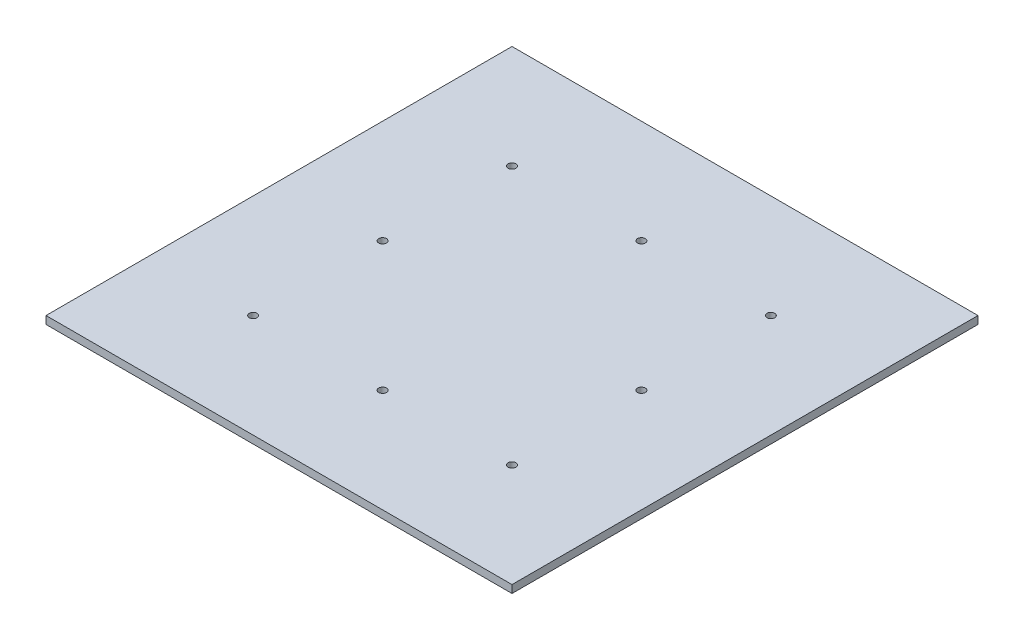
ISO-10303-21;
HEADER;
FILE_DESCRIPTION(('STEP AP214'),'2;1');
FILE_NAME('part.step','',(''),(''),'','','');
FILE_SCHEMA(('AUTOMOTIVE_DESIGN { 1 0 10303 214 1 1 1 1 }'));
ENDSEC;
DATA;
#1=APPLICATION_CONTEXT('core data for automotive mechanical design processes');
#2=APPLICATION_PROTOCOL_DEFINITION('international standard','automotive_design',2000,#1);
#3=PRODUCT_CONTEXT('',#1,'mechanical');
#4=PRODUCT('Part','Part','',(#3));
#5=PRODUCT_RELATED_PRODUCT_CATEGORY('part','',(#4));
#6=PRODUCT_DEFINITION_FORMATION('','',#4);
#7=PRODUCT_DEFINITION_CONTEXT('part definition',#1,'design');
#8=PRODUCT_DEFINITION('design','',#6,#7);
#9=PRODUCT_DEFINITION_SHAPE('','',#8);
#10=(LENGTH_UNIT() NAMED_UNIT(*) SI_UNIT(.MILLI.,.METRE.));
#11=(NAMED_UNIT(*) PLANE_ANGLE_UNIT() SI_UNIT($,.RADIAN.));
#12=(NAMED_UNIT(*) SI_UNIT($,.STERADIAN.) SOLID_ANGLE_UNIT());
#13=UNCERTAINTY_MEASURE_WITH_UNIT(LENGTH_MEASURE(1.E-05),#10,'distance_accuracy_value','');
#14=(GEOMETRIC_REPRESENTATION_CONTEXT(3) GLOBAL_UNCERTAINTY_ASSIGNED_CONTEXT((#13)) GLOBAL_UNIT_ASSIGNED_CONTEXT((#10,
#11,#12)) REPRESENTATION_CONTEXT('',''));
#15=CARTESIAN_POINT('',(0.,0.,0.));
#16=DIRECTION('',(0.,0.,1.));
#17=DIRECTION('',(1.,0.,0.));
#18=AXIS2_PLACEMENT_3D('',#15,#16,#17);
#19=CARTESIAN_POINT('',(0.,3.,0.));
#20=DIRECTION('',(1.,0.,0.));
#21=DIRECTION('',(0.,0.,-1.));
#22=AXIS2_PLACEMENT_3D('',#19,#20,#21);
#23=PLANE('',#22);
#24=DIRECTION('',(0.,0.,1.));
#25=VECTOR('',#24,1.);
#26=CARTESIAN_POINT('',(0.,0.,0.));
#27=LINE('',#26,#25);
#28=CARTESIAN_POINT('',(0.,0.,0.));
#29=VERTEX_POINT('',#28);
#30=CARTESIAN_POINT('',(0.,0.,180.));
#31=VERTEX_POINT('',#30);
#32=EDGE_CURVE('E113',#29,#31,#27,.T.);
#33=ORIENTED_EDGE('',*,*,#32,.T.);
#34=DIRECTION('',(0.,-1.,0.));
#35=VECTOR('',#34,1.);
#36=CARTESIAN_POINT('',(0.,3.,180.));
#37=LINE('',#36,#35);
#38=CARTESIAN_POINT('',(0.,3.,180.));
#39=VERTEX_POINT('',#38);
#40=EDGE_CURVE('E11',#39,#31,#37,.T.);
#41=ORIENTED_EDGE('',*,*,#40,.F.);
#42=DIRECTION('',(0.,0.,1.));
#43=VECTOR('',#42,1.);
#44=CARTESIAN_POINT('',(0.,3.,0.));
#45=LINE('',#44,#43);
#46=CARTESIAN_POINT('',(0.,3.,0.));
#47=VERTEX_POINT('',#46);
#48=EDGE_CURVE('E97',#47,#39,#45,.T.);
#49=ORIENTED_EDGE('',*,*,#48,.F.);
#50=DIRECTION('',(0.,-1.,0.));
#51=VECTOR('',#50,1.);
#52=CARTESIAN_POINT('',(0.,3.,0.));
#53=LINE('',#52,#51);
#54=EDGE_CURVE('E109',#47,#29,#53,.T.);
#55=ORIENTED_EDGE('',*,*,#54,.T.);
#56=EDGE_LOOP('',(#33,#41,#49,#55));
#57=FACE_BOUND('',#56,.T.);
#58=ADVANCED_FACE('F45',(#57),#23,.F.);
#59=CARTESIAN_POINT('',(0.,3.,180.));
#60=DIRECTION('',(0.,0.,-1.));
#61=DIRECTION('',(-1.,0.,0.));
#62=AXIS2_PLACEMENT_3D('',#59,#60,#61);
#63=PLANE('',#62);
#64=DIRECTION('',(1.,0.,0.));
#65=VECTOR('',#64,1.);
#66=CARTESIAN_POINT('',(0.,0.,180.));
#67=LINE('',#66,#65);
#68=CARTESIAN_POINT('',(180.,0.,180.));
#69=VERTEX_POINT('',#68);
#70=EDGE_CURVE('E102',#31,#69,#67,.T.);
#71=ORIENTED_EDGE('',*,*,#70,.T.);
#72=DIRECTION('',(0.,-1.,0.));
#73=VECTOR('',#72,1.);
#74=CARTESIAN_POINT('',(180.,3.,180.));
#75=LINE('',#74,#73);
#76=CARTESIAN_POINT('',(180.,3.,180.));
#77=VERTEX_POINT('',#76);
#78=EDGE_CURVE('E54',#77,#69,#75,.T.);
#79=ORIENTED_EDGE('',*,*,#78,.F.);
#80=DIRECTION('',(1.,0.,0.));
#81=VECTOR('',#80,1.);
#82=CARTESIAN_POINT('',(0.,3.,180.));
#83=LINE('',#82,#81);
#84=EDGE_CURVE('E92',#39,#77,#83,.T.);
#85=ORIENTED_EDGE('',*,*,#84,.F.);
#86=ORIENTED_EDGE('',*,*,#40,.T.);
#87=EDGE_LOOP('',(#71,#79,#85,#86));
#88=FACE_BOUND('',#87,.T.);
#89=ADVANCED_FACE('F101',(#88),#63,.F.);
#90=CARTESIAN_POINT('',(180.,3.,0.));
#91=DIRECTION('',(-1.,0.,0.));
#92=DIRECTION('',(0.,0.,1.));
#93=AXIS2_PLACEMENT_3D('',#90,#91,#92);
#94=PLANE('',#93);
#95=DIRECTION('',(0.,0.,-1.));
#96=VECTOR('',#95,1.);
#97=CARTESIAN_POINT('',(180.,0.,0.));
#98=LINE('',#97,#96);
#99=CARTESIAN_POINT('',(180.,0.,0.));
#100=VERTEX_POINT('',#99);
#101=EDGE_CURVE('E79',#69,#100,#98,.T.);
#102=ORIENTED_EDGE('',*,*,#101,.T.);
#103=DIRECTION('',(0.,-1.,0.));
#104=VECTOR('',#103,1.);
#105=CARTESIAN_POINT('',(180.,3.,0.));
#106=LINE('',#105,#104);
#107=CARTESIAN_POINT('',(180.,3.,0.));
#108=VERTEX_POINT('',#107);
#109=EDGE_CURVE('E104',#108,#100,#106,.T.);
#110=ORIENTED_EDGE('',*,*,#109,.F.);
#111=DIRECTION('',(0.,0.,-1.));
#112=VECTOR('',#111,1.);
#113=CARTESIAN_POINT('',(180.,3.,0.));
#114=LINE('',#113,#112);
#115=EDGE_CURVE('E95',#77,#108,#114,.T.);
#116=ORIENTED_EDGE('',*,*,#115,.F.);
#117=ORIENTED_EDGE('',*,*,#78,.T.);
#118=EDGE_LOOP('',(#102,#110,#116,#117));
#119=FACE_BOUND('',#118,.T.);
#120=ADVANCED_FACE('F105',(#119),#94,.F.);
#121=CARTESIAN_POINT('',(0.,3.,0.));
#122=DIRECTION('',(0.,0.,1.));
#123=DIRECTION('',(1.,0.,0.));
#124=AXIS2_PLACEMENT_3D('',#121,#122,#123);
#125=PLANE('',#124);
#126=DIRECTION('',(-1.,0.,0.));
#127=VECTOR('',#126,1.);
#128=CARTESIAN_POINT('',(0.,0.,0.));
#129=LINE('',#128,#127);
#130=EDGE_CURVE('E85',#100,#29,#129,.T.);
#131=ORIENTED_EDGE('',*,*,#130,.T.);
#132=ORIENTED_EDGE('',*,*,#54,.F.);
#133=DIRECTION('',(-1.,0.,0.));
#134=VECTOR('',#133,1.);
#135=CARTESIAN_POINT('',(0.,3.,0.));
#136=LINE('',#135,#134);
#137=EDGE_CURVE('E62',#108,#47,#136,.T.);
#138=ORIENTED_EDGE('',*,*,#137,.F.);
#139=ORIENTED_EDGE('',*,*,#109,.T.);
#140=EDGE_LOOP('',(#131,#132,#138,#139));
#141=FACE_BOUND('',#140,.T.);
#142=ADVANCED_FACE('F127',(#141),#125,.F.);
#143=CARTESIAN_POINT('',(0.,3.,0.));
#144=DIRECTION('',(0.,1.,0.));
#145=DIRECTION('',(0.,0.,1.));
#146=AXIS2_PLACEMENT_3D('',#143,#144,#145);
#147=PLANE('',#146);
#148=CARTESIAN_POINT('',(140.,3.,40.));
#149=DIRECTION('',(0.,1.,0.));
#150=DIRECTION('',(0.,0.,1.));
#151=AXIS2_PLACEMENT_3D('',#148,#149,#150);
#152=CIRCLE('',#151,1.50000000000003);
#153=CARTESIAN_POINT('',(140.,3.,41.5));
#154=VERTEX_POINT('',#153);
#155=EDGE_CURVE('E138',#154,#154,#152,.T.);
#156=ORIENTED_EDGE('',*,*,#155,.F.);
#157=EDGE_LOOP('',(#156));
#158=FACE_BOUND('',#157,.T.);
#159=CARTESIAN_POINT('',(140.,3.,140.));
#160=DIRECTION('',(0.,1.,0.));
#161=DIRECTION('',(0.,0.,1.));
#162=AXIS2_PLACEMENT_3D('',#159,#160,#161);
#163=CIRCLE('',#162,1.50000000000002);
#164=CARTESIAN_POINT('',(140.,3.,141.5));
#165=VERTEX_POINT('',#164);
#166=EDGE_CURVE('E163',#165,#165,#163,.T.);
#167=ORIENTED_EDGE('',*,*,#166,.F.);
#168=EDGE_LOOP('',(#167));
#169=FACE_BOUND('',#168,.T.);
#170=CARTESIAN_POINT('',(40.,3.,140.));
#171=DIRECTION('',(0.,1.,0.));
#172=DIRECTION('',(0.,0.,1.));
#173=AXIS2_PLACEMENT_3D('',#170,#171,#172);
#174=CIRCLE('',#173,1.5);
#175=CARTESIAN_POINT('',(40.,3.,141.5));
#176=VERTEX_POINT('',#175);
#177=EDGE_CURVE('E155',#176,#176,#174,.T.);
#178=ORIENTED_EDGE('',*,*,#177,.F.);
#179=EDGE_LOOP('',(#178));
#180=FACE_BOUND('',#179,.T.);
#181=CARTESIAN_POINT('',(90.,3.,40.));
#182=DIRECTION('',(0.,1.,0.));
#183=DIRECTION('',(0.,0.,1.));
#184=AXIS2_PLACEMENT_3D('',#181,#182,#183);
#185=CIRCLE('',#184,1.5);
#186=CARTESIAN_POINT('',(90.,3.,41.5));
#187=VERTEX_POINT('',#186);
#188=EDGE_CURVE('E146',#187,#187,#185,.T.);
#189=ORIENTED_EDGE('',*,*,#188,.F.);
#190=EDGE_LOOP('',(#189));
#191=FACE_BOUND('',#190,.T.);
#192=CARTESIAN_POINT('',(140.,3.,90.));
#193=DIRECTION('',(0.,1.,0.));
#194=DIRECTION('',(0.,0.,1.));
#195=AXIS2_PLACEMENT_3D('',#192,#193,#194);
#196=CIRCLE('',#195,1.5);
#197=CARTESIAN_POINT('',(140.,3.,91.5));
#198=VERTEX_POINT('',#197);
#199=EDGE_CURVE('E147',#198,#198,#196,.T.);
#200=ORIENTED_EDGE('',*,*,#199,.F.);
#201=EDGE_LOOP('',(#200));
#202=FACE_BOUND('',#201,.T.);
#203=CARTESIAN_POINT('',(90.,3.,140.));
#204=DIRECTION('',(0.,1.,0.));
#205=DIRECTION('',(0.,0.,1.));
#206=AXIS2_PLACEMENT_3D('',#203,#204,#205);
#207=CIRCLE('',#206,1.5);
#208=CARTESIAN_POINT('',(90.,3.,141.5));
#209=VERTEX_POINT('',#208);
#210=EDGE_CURVE('E186',#209,#209,#207,.T.);
#211=ORIENTED_EDGE('',*,*,#210,.F.);
#212=EDGE_LOOP('',(#211));
#213=FACE_BOUND('',#212,.T.);
#214=CARTESIAN_POINT('',(40.,3.,90.));
#215=DIRECTION('',(0.,1.,0.));
#216=DIRECTION('',(0.,0.,1.));
#217=AXIS2_PLACEMENT_3D('',#214,#215,#216);
#218=CIRCLE('',#217,1.5);
#219=CARTESIAN_POINT('',(40.,3.,91.5));
#220=VERTEX_POINT('',#219);
#221=EDGE_CURVE('E178',#220,#220,#218,.T.);
#222=ORIENTED_EDGE('',*,*,#221,.F.);
#223=EDGE_LOOP('',(#222));
#224=FACE_BOUND('',#223,.T.);
#225=CARTESIAN_POINT('',(40.,3.,40.));
#226=DIRECTION('',(0.,1.,0.));
#227=DIRECTION('',(0.,0.,1.));
#228=AXIS2_PLACEMENT_3D('',#225,#226,#227);
#229=CIRCLE('',#228,1.5);
#230=CARTESIAN_POINT('',(40.,3.,41.5));
#231=VERTEX_POINT('',#230);
#232=EDGE_CURVE('E134',#231,#231,#229,.T.);
#233=ORIENTED_EDGE('',*,*,#232,.F.);
#234=EDGE_LOOP('',(#233));
#235=FACE_BOUND('',#234,.T.);
#236=ORIENTED_EDGE('',*,*,#48,.T.);
#237=ORIENTED_EDGE('',*,*,#84,.T.);
#238=ORIENTED_EDGE('',*,*,#115,.T.);
#239=ORIENTED_EDGE('',*,*,#137,.T.);
#240=EDGE_LOOP('',(#236,#237,#238,#239));
#241=FACE_BOUND('',#240,.T.);
#242=ADVANCED_FACE('F93',(#158,#169,#180,#191,#202,#213,#224,#235,#241),#147,.T.);
#243=CARTESIAN_POINT('',(0.,0.,0.));
#244=DIRECTION('',(0.,1.,0.));
#245=DIRECTION('',(0.,0.,1.));
#246=AXIS2_PLACEMENT_3D('',#243,#244,#245);
#247=PLANE('',#246);
#248=CARTESIAN_POINT('',(140.,0.,40.));
#249=DIRECTION('',(0.,1.,0.));
#250=DIRECTION('',(0.,0.,1.));
#251=AXIS2_PLACEMENT_3D('',#248,#249,#250);
#252=CIRCLE('',#251,1.50000000000003);
#253=CARTESIAN_POINT('',(140.,0.,41.5));
#254=VERTEX_POINT('',#253);
#255=EDGE_CURVE('E167',#254,#254,#252,.T.);
#256=ORIENTED_EDGE('',*,*,#255,.T.);
#257=EDGE_LOOP('',(#256));
#258=FACE_BOUND('',#257,.T.);
#259=CARTESIAN_POINT('',(140.,0.,140.));
#260=DIRECTION('',(0.,1.,0.));
#261=DIRECTION('',(0.,0.,1.));
#262=AXIS2_PLACEMENT_3D('',#259,#260,#261);
#263=CIRCLE('',#262,1.50000000000002);
#264=CARTESIAN_POINT('',(140.,0.,141.5));
#265=VERTEX_POINT('',#264);
#266=EDGE_CURVE('E159',#265,#265,#263,.T.);
#267=ORIENTED_EDGE('',*,*,#266,.T.);
#268=EDGE_LOOP('',(#267));
#269=FACE_BOUND('',#268,.T.);
#270=CARTESIAN_POINT('',(40.,0.,140.));
#271=DIRECTION('',(0.,1.,0.));
#272=DIRECTION('',(0.,0.,1.));
#273=AXIS2_PLACEMENT_3D('',#270,#271,#272);
#274=CIRCLE('',#273,1.5);
#275=CARTESIAN_POINT('',(40.,0.,141.5));
#276=VERTEX_POINT('',#275);
#277=EDGE_CURVE('E151',#276,#276,#274,.T.);
#278=ORIENTED_EDGE('',*,*,#277,.T.);
#279=EDGE_LOOP('',(#278));
#280=FACE_BOUND('',#279,.T.);
#281=CARTESIAN_POINT('',(90.,0.,40.));
#282=DIRECTION('',(0.,1.,0.));
#283=DIRECTION('',(0.,0.,1.));
#284=AXIS2_PLACEMENT_3D('',#281,#282,#283);
#285=CIRCLE('',#284,1.5);
#286=CARTESIAN_POINT('',(90.,0.,41.5));
#287=VERTEX_POINT('',#286);
#288=EDGE_CURVE('E142',#287,#287,#285,.T.);
#289=ORIENTED_EDGE('',*,*,#288,.T.);
#290=EDGE_LOOP('',(#289));
#291=FACE_BOUND('',#290,.T.);
#292=CARTESIAN_POINT('',(140.,0.,90.));
#293=DIRECTION('',(0.,1.,0.));
#294=DIRECTION('',(0.,0.,1.));
#295=AXIS2_PLACEMENT_3D('',#292,#293,#294);
#296=CIRCLE('',#295,1.5);
#297=CARTESIAN_POINT('',(140.,0.,91.5));
#298=VERTEX_POINT('',#297);
#299=EDGE_CURVE('E190',#298,#298,#296,.T.);
#300=ORIENTED_EDGE('',*,*,#299,.T.);
#301=EDGE_LOOP('',(#300));
#302=FACE_BOUND('',#301,.T.);
#303=CARTESIAN_POINT('',(90.,0.,140.));
#304=DIRECTION('',(0.,1.,0.));
#305=DIRECTION('',(0.,0.,1.));
#306=AXIS2_PLACEMENT_3D('',#303,#304,#305);
#307=CIRCLE('',#306,1.5);
#308=CARTESIAN_POINT('',(90.,0.,141.5));
#309=VERTEX_POINT('',#308);
#310=EDGE_CURVE('E182',#309,#309,#307,.T.);
#311=ORIENTED_EDGE('',*,*,#310,.T.);
#312=EDGE_LOOP('',(#311));
#313=FACE_BOUND('',#312,.T.);
#314=CARTESIAN_POINT('',(40.,0.,90.));
#315=DIRECTION('',(0.,1.,0.));
#316=DIRECTION('',(0.,0.,1.));
#317=AXIS2_PLACEMENT_3D('',#314,#315,#316);
#318=CIRCLE('',#317,1.5);
#319=CARTESIAN_POINT('',(40.,0.,91.5));
#320=VERTEX_POINT('',#319);
#321=EDGE_CURVE('E174',#320,#320,#318,.T.);
#322=ORIENTED_EDGE('',*,*,#321,.T.);
#323=EDGE_LOOP('',(#322));
#324=FACE_BOUND('',#323,.T.);
#325=CARTESIAN_POINT('',(40.,0.,40.));
#326=DIRECTION('',(0.,1.,0.));
#327=DIRECTION('',(0.,0.,1.));
#328=AXIS2_PLACEMENT_3D('',#325,#326,#327);
#329=CIRCLE('',#328,1.5);
#330=CARTESIAN_POINT('',(40.,0.,41.5));
#331=VERTEX_POINT('',#330);
#332=EDGE_CURVE('E117',#331,#331,#329,.T.);
#333=ORIENTED_EDGE('',*,*,#332,.T.);
#334=EDGE_LOOP('',(#333));
#335=FACE_BOUND('',#334,.T.);
#336=ORIENTED_EDGE('',*,*,#32,.F.);
#337=ORIENTED_EDGE('',*,*,#130,.F.);
#338=ORIENTED_EDGE('',*,*,#101,.F.);
#339=ORIENTED_EDGE('',*,*,#70,.F.);
#340=EDGE_LOOP('',(#336,#337,#338,#339));
#341=FACE_BOUND('',#340,.T.);
#342=ADVANCED_FACE('F130',(#258,#269,#280,#291,#302,#313,#324,#335,#341),#247,.F.);
#343=CARTESIAN_POINT('',(40.,0.,40.));
#344=DIRECTION('',(0.,1.,0.));
#345=DIRECTION('',(0.,0.,1.));
#346=AXIS2_PLACEMENT_3D('',#343,#344,#345);
#347=CYLINDRICAL_SURFACE('',#346,1.5);
#348=ORIENTED_EDGE('',*,*,#332,.F.);
#349=EDGE_LOOP('',(#348));
#350=FACE_BOUND('',#349,.T.);
#351=ORIENTED_EDGE('',*,*,#232,.T.);
#352=EDGE_LOOP('',(#351));
#353=FACE_BOUND('',#352,.T.);
#354=ADVANCED_FACE('F210',(#350,#353),#347,.F.);
#355=CARTESIAN_POINT('',(40.,0.,90.));
#356=DIRECTION('',(0.,1.,0.));
#357=DIRECTION('',(0.,0.,1.));
#358=AXIS2_PLACEMENT_3D('',#355,#356,#357);
#359=CYLINDRICAL_SURFACE('',#358,1.5);
#360=ORIENTED_EDGE('',*,*,#321,.F.);
#361=EDGE_LOOP('',(#360));
#362=FACE_BOUND('',#361,.T.);
#363=ORIENTED_EDGE('',*,*,#221,.T.);
#364=EDGE_LOOP('',(#363));
#365=FACE_BOUND('',#364,.T.);
#366=ADVANCED_FACE('F212',(#362,#365),#359,.F.);
#367=CARTESIAN_POINT('',(90.,0.,140.));
#368=DIRECTION('',(0.,1.,0.));
#369=DIRECTION('',(0.,0.,1.));
#370=AXIS2_PLACEMENT_3D('',#367,#368,#369);
#371=CYLINDRICAL_SURFACE('',#370,1.5);
#372=ORIENTED_EDGE('',*,*,#310,.F.);
#373=EDGE_LOOP('',(#372));
#374=FACE_BOUND('',#373,.T.);
#375=ORIENTED_EDGE('',*,*,#210,.T.);
#376=EDGE_LOOP('',(#375));
#377=FACE_BOUND('',#376,.T.);
#378=ADVANCED_FACE('F219',(#374,#377),#371,.F.);
#379=CARTESIAN_POINT('',(140.,0.,90.));
#380=DIRECTION('',(0.,1.,0.));
#381=DIRECTION('',(0.,0.,1.));
#382=AXIS2_PLACEMENT_3D('',#379,#380,#381);
#383=CYLINDRICAL_SURFACE('',#382,1.5);
#384=ORIENTED_EDGE('',*,*,#299,.F.);
#385=EDGE_LOOP('',(#384));
#386=FACE_BOUND('',#385,.T.);
#387=ORIENTED_EDGE('',*,*,#199,.T.);
#388=EDGE_LOOP('',(#387));
#389=FACE_BOUND('',#388,.T.);
#390=ADVANCED_FACE('F198',(#386,#389),#383,.F.);
#391=CARTESIAN_POINT('',(90.,0.,40.));
#392=DIRECTION('',(0.,1.,0.));
#393=DIRECTION('',(0.,0.,1.));
#394=AXIS2_PLACEMENT_3D('',#391,#392,#393);
#395=CYLINDRICAL_SURFACE('',#394,1.5);
#396=ORIENTED_EDGE('',*,*,#288,.F.);
#397=EDGE_LOOP('',(#396));
#398=FACE_BOUND('',#397,.T.);
#399=ORIENTED_EDGE('',*,*,#188,.T.);
#400=EDGE_LOOP('',(#399));
#401=FACE_BOUND('',#400,.T.);
#402=ADVANCED_FACE('F279',(#398,#401),#395,.F.);
#403=CARTESIAN_POINT('',(40.,0.,140.));
#404=DIRECTION('',(0.,1.,0.));
#405=DIRECTION('',(0.,0.,1.));
#406=AXIS2_PLACEMENT_3D('',#403,#404,#405);
#407=CYLINDRICAL_SURFACE('',#406,1.5);
#408=ORIENTED_EDGE('',*,*,#277,.F.);
#409=EDGE_LOOP('',(#408));
#410=FACE_BOUND('',#409,.T.);
#411=ORIENTED_EDGE('',*,*,#177,.T.);
#412=EDGE_LOOP('',(#411));
#413=FACE_BOUND('',#412,.T.);
#414=ADVANCED_FACE('F289',(#410,#413),#407,.F.);
#415=CARTESIAN_POINT('',(140.,0.,140.));
#416=DIRECTION('',(0.,1.,0.));
#417=DIRECTION('',(0.,0.,1.));
#418=AXIS2_PLACEMENT_3D('',#415,#416,#417);
#419=CYLINDRICAL_SURFACE('',#418,1.50000000000002);
#420=ORIENTED_EDGE('',*,*,#266,.F.);
#421=EDGE_LOOP('',(#420));
#422=FACE_BOUND('',#421,.T.);
#423=ORIENTED_EDGE('',*,*,#166,.T.);
#424=EDGE_LOOP('',(#423));
#425=FACE_BOUND('',#424,.T.);
#426=ADVANCED_FACE('F298',(#422,#425),#419,.F.);
#427=CARTESIAN_POINT('',(140.,0.,40.));
#428=DIRECTION('',(0.,1.,0.));
#429=DIRECTION('',(0.,0.,1.));
#430=AXIS2_PLACEMENT_3D('',#427,#428,#429);
#431=CYLINDRICAL_SURFACE('',#430,1.50000000000003);
#432=ORIENTED_EDGE('',*,*,#255,.F.);
#433=EDGE_LOOP('',(#432));
#434=FACE_BOUND('',#433,.T.);
#435=ORIENTED_EDGE('',*,*,#155,.T.);
#436=EDGE_LOOP('',(#435));
#437=FACE_BOUND('',#436,.T.);
#438=ADVANCED_FACE('F308',(#434,#437),#431,.F.);
#439=CLOSED_SHELL('',(#58,#89,#120,#142,#242,#342,#354,#366,#378,#390,#402,#414,#426,#438));
#440=MANIFOLD_SOLID_BREP('B2',#439);
#441=ADVANCED_BREP_SHAPE_REPRESENTATION('',(#18,#440),#14);
#442=SHAPE_DEFINITION_REPRESENTATION(#9,#441);
ENDSEC;
END-ISO-10303-21;
